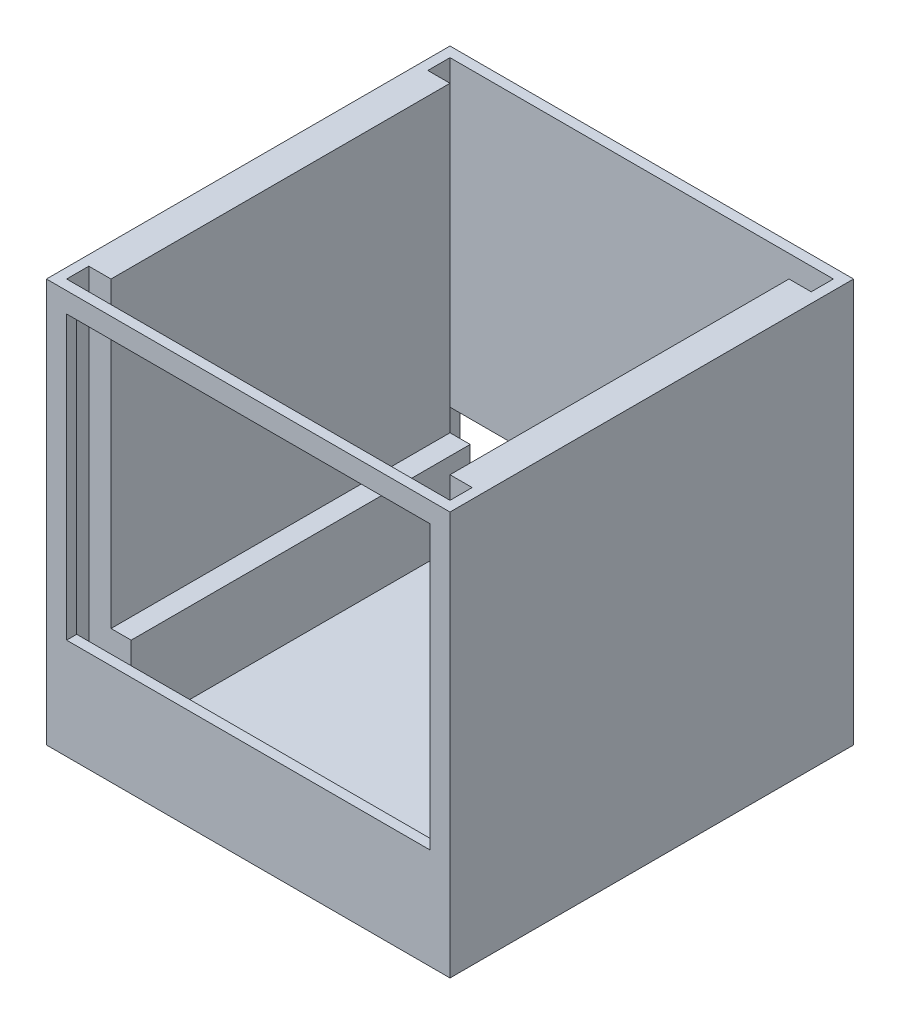
ISO-10303-21;
HEADER;
FILE_DESCRIPTION(('STEP AP214'),'2;1');
FILE_NAME('part.step','',(''),(''),'','','');
FILE_SCHEMA(('AUTOMOTIVE_DESIGN { 1 0 10303 214 1 1 1 1 }'));
ENDSEC;
DATA;
#1=APPLICATION_CONTEXT('core data for automotive mechanical design processes');
#2=APPLICATION_PROTOCOL_DEFINITION('international standard','automotive_design',2000,#1);
#3=PRODUCT_CONTEXT('',#1,'mechanical');
#4=PRODUCT('Part','Part','',(#3));
#5=PRODUCT_RELATED_PRODUCT_CATEGORY('part','',(#4));
#6=PRODUCT_DEFINITION_FORMATION('','',#4);
#7=PRODUCT_DEFINITION_CONTEXT('part definition',#1,'design');
#8=PRODUCT_DEFINITION('design','',#6,#7);
#9=PRODUCT_DEFINITION_SHAPE('','',#8);
#10=(LENGTH_UNIT() NAMED_UNIT(*) SI_UNIT(.MILLI.,.METRE.));
#11=(NAMED_UNIT(*) PLANE_ANGLE_UNIT() SI_UNIT($,.RADIAN.));
#12=(NAMED_UNIT(*) SI_UNIT($,.STERADIAN.) SOLID_ANGLE_UNIT());
#13=UNCERTAINTY_MEASURE_WITH_UNIT(LENGTH_MEASURE(1.E-05),#10,'distance_accuracy_value','');
#14=(GEOMETRIC_REPRESENTATION_CONTEXT(3) GLOBAL_UNCERTAINTY_ASSIGNED_CONTEXT((#13)) GLOBAL_UNIT_ASSIGNED_CONTEXT((#10,
#11,#12)) REPRESENTATION_CONTEXT('',''));
#15=CARTESIAN_POINT('',(0.,0.,0.));
#16=DIRECTION('',(0.,0.,1.));
#17=DIRECTION('',(1.,0.,0.));
#18=AXIS2_PLACEMENT_3D('',#15,#16,#17);
#19=CARTESIAN_POINT('',(0.,-50.8,0.));
#20=DIRECTION('',(0.,-1.,0.));
#21=DIRECTION('',(0.,0.,-1.));
#22=AXIS2_PLACEMENT_3D('',#19,#20,#21);
#23=PLANE('',#22);
#24=DIRECTION('',(0.,0.,1.));
#25=VECTOR('',#24,1.);
#26=CARTESIAN_POINT('',(93.98,-50.8,-106.68));
#27=LINE('',#26,#25);
#28=CARTESIAN_POINT('',(93.98,-50.8,-106.68));
#29=VERTEX_POINT('',#28);
#30=CARTESIAN_POINT('',(93.98,-50.8,106.68));
#31=VERTEX_POINT('',#30);
#32=EDGE_CURVE('E226',#29,#31,#27,.T.);
#33=ORIENTED_EDGE('',*,*,#32,.F.);
#34=DIRECTION('',(-1.,0.,0.));
#35=VECTOR('',#34,1.);
#36=CARTESIAN_POINT('',(0.,-50.8,-106.68));
#37=LINE('',#36,#35);
#38=CARTESIAN_POINT('',(120.65,-50.8,-106.68));
#39=VERTEX_POINT('',#38);
#40=EDGE_CURVE('E232',#39,#29,#37,.T.);
#41=ORIENTED_EDGE('',*,*,#40,.F.);
#42=DIRECTION('',(0.,0.,-1.));
#43=VECTOR('',#42,1.);
#44=CARTESIAN_POINT('',(120.65,-50.8,0.));
#45=LINE('',#44,#43);
#46=CARTESIAN_POINT('',(120.65,-50.8,-127.));
#47=VERTEX_POINT('',#46);
#48=EDGE_CURVE('E355',#39,#47,#45,.T.);
#49=ORIENTED_EDGE('',*,*,#48,.T.);
#50=DIRECTION('',(1.,0.,0.));
#51=VECTOR('',#50,1.);
#52=CARTESIAN_POINT('',(-127.,-50.8,-127.));
#53=LINE('',#52,#51);
#54=CARTESIAN_POINT('',(-120.65,-50.8,-127.));
#55=VERTEX_POINT('',#54);
#56=EDGE_CURVE('E338',#55,#47,#53,.T.);
#57=ORIENTED_EDGE('',*,*,#56,.F.);
#58=DIRECTION('',(0.,0.,-1.));
#59=VECTOR('',#58,1.);
#60=CARTESIAN_POINT('',(-120.65,-50.8,0.));
#61=LINE('',#60,#59);
#62=CARTESIAN_POINT('',(-120.65,-50.8,-106.68));
#63=VERTEX_POINT('',#62);
#64=EDGE_CURVE('E361',#63,#55,#61,.T.);
#65=ORIENTED_EDGE('',*,*,#64,.F.);
#66=DIRECTION('',(1.,0.,0.));
#67=VECTOR('',#66,1.);
#68=CARTESIAN_POINT('',(0.,-50.8,-106.68));
#69=LINE('',#68,#67);
#70=CARTESIAN_POINT('',(-93.98,-50.8,-106.68));
#71=VERTEX_POINT('',#70);
#72=EDGE_CURVE('E290',#63,#71,#69,.T.);
#73=ORIENTED_EDGE('',*,*,#72,.T.);
#74=DIRECTION('',(0.,0.,1.));
#75=VECTOR('',#74,1.);
#76=CARTESIAN_POINT('',(-93.98,-50.8,0.));
#77=LINE('',#76,#75);
#78=CARTESIAN_POINT('',(-93.98,-50.8,106.68));
#79=VERTEX_POINT('',#78);
#80=EDGE_CURVE('E249',#71,#79,#77,.T.);
#81=ORIENTED_EDGE('',*,*,#80,.T.);
#82=DIRECTION('',(1.,0.,0.));
#83=VECTOR('',#82,1.);
#84=CARTESIAN_POINT('',(0.,-50.8,106.68));
#85=LINE('',#84,#83);
#86=CARTESIAN_POINT('',(-120.65,-50.8,106.68));
#87=VERTEX_POINT('',#86);
#88=EDGE_CURVE('E293',#87,#79,#85,.T.);
#89=ORIENTED_EDGE('',*,*,#88,.F.);
#90=CARTESIAN_POINT('',(-120.65,-50.8,120.65));
#91=VERTEX_POINT('',#90);
#92=EDGE_CURVE('E362',#91,#87,#61,.T.);
#93=ORIENTED_EDGE('',*,*,#92,.F.);
#94=DIRECTION('',(1.,0.,0.));
#95=VECTOR('',#94,1.);
#96=CARTESIAN_POINT('',(0.,-50.8,120.65));
#97=LINE('',#96,#95);
#98=CARTESIAN_POINT('',(120.65,-50.8,120.65));
#99=VERTEX_POINT('',#98);
#100=EDGE_CURVE('E366',#91,#99,#97,.T.);
#101=ORIENTED_EDGE('',*,*,#100,.T.);
#102=CARTESIAN_POINT('',(120.65,-50.8,106.68));
#103=VERTEX_POINT('',#102);
#104=EDGE_CURVE('E228',#99,#103,#45,.T.);
#105=ORIENTED_EDGE('',*,*,#104,.T.);
#106=DIRECTION('',(-1.,0.,0.));
#107=VECTOR('',#106,1.);
#108=CARTESIAN_POINT('',(0.,-50.8,106.68));
#109=LINE('',#108,#107);
#110=EDGE_CURVE('E222',#103,#31,#109,.T.);
#111=ORIENTED_EDGE('',*,*,#110,.T.);
#112=EDGE_LOOP('',(#33,#41,#49,#57,#65,#73,#81,#89,#93,#101,#105,#111));
#113=FACE_BOUND('',#112,.T.);
#114=ADVANCED_FACE('F45',(#113),#23,.F.);
#115=CARTESIAN_POINT('',(-120.65,190.5,0.));
#116=DIRECTION('',(-1.,0.,0.));
#117=DIRECTION('',(0.,0.,1.));
#118=AXIS2_PLACEMENT_3D('',#115,#116,#117);
#119=PLANE('',#118);
#120=DIRECTION('',(0.,-1.,0.));
#121=VECTOR('',#120,1.);
#122=CARTESIAN_POINT('',(-120.65,190.5,-106.68));
#123=LINE('',#122,#121);
#124=CARTESIAN_POINT('',(-120.65,190.5,-106.68));
#125=VERTEX_POINT('',#124);
#126=EDGE_CURVE('E63',#125,#63,#123,.T.);
#127=ORIENTED_EDGE('',*,*,#126,.T.);
#128=ORIENTED_EDGE('',*,*,#64,.T.);
#129=DIRECTION('',(0.,1.,0.));
#130=VECTOR('',#129,1.);
#131=CARTESIAN_POINT('',(-120.65,-50.8,-127.));
#132=LINE('',#131,#130);
#133=CARTESIAN_POINT('',(-120.65,0.,-127.));
#134=VERTEX_POINT('',#133);
#135=EDGE_CURVE('E368',#55,#134,#132,.T.);
#136=ORIENTED_EDGE('',*,*,#135,.T.);
#137=DIRECTION('',(0.,0.,-1.));
#138=VECTOR('',#137,1.);
#139=CARTESIAN_POINT('',(-120.65,0.,0.));
#140=LINE('',#139,#138);
#141=CARTESIAN_POINT('',(-120.65,0.,-120.65));
#142=VERTEX_POINT('',#141);
#143=EDGE_CURVE('E55',#142,#134,#140,.T.);
#144=ORIENTED_EDGE('',*,*,#143,.F.);
#145=DIRECTION('',(0.,-1.,0.));
#146=VECTOR('',#145,1.);
#147=CARTESIAN_POINT('',(-120.65,190.5,-120.65));
#148=LINE('',#147,#146);
#149=CARTESIAN_POINT('',(-120.65,190.5,-120.65));
#150=VERTEX_POINT('',#149);
#151=EDGE_CURVE('E433',#150,#142,#148,.T.);
#152=ORIENTED_EDGE('',*,*,#151,.F.);
#153=DIRECTION('',(0.,0.,-1.));
#154=VECTOR('',#153,1.);
#155=CARTESIAN_POINT('',(-120.65,190.5,0.));
#156=LINE('',#155,#154);
#157=EDGE_CURVE('E408',#125,#150,#156,.T.);
#158=ORIENTED_EDGE('',*,*,#157,.F.);
#159=EDGE_LOOP('',(#127,#128,#136,#144,#152,#158));
#160=FACE_BOUND('',#159,.T.);
#161=ADVANCED_FACE('F515',(#160),#119,.F.);
#162=CARTESIAN_POINT('',(120.65,190.5,0.));
#163=DIRECTION('',(-1.,0.,0.));
#164=DIRECTION('',(0.,0.,1.));
#165=AXIS2_PLACEMENT_3D('',#162,#163,#164);
#166=PLANE('',#165);
#167=DIRECTION('',(0.,-1.,0.));
#168=VECTOR('',#167,1.);
#169=CARTESIAN_POINT('',(120.65,190.5,106.68));
#170=LINE('',#169,#168);
#171=CARTESIAN_POINT('',(120.65,190.5,106.68));
#172=VERTEX_POINT('',#171);
#173=EDGE_CURVE('E473',#172,#103,#170,.T.);
#174=ORIENTED_EDGE('',*,*,#173,.T.);
#175=ORIENTED_EDGE('',*,*,#104,.F.);
#176=DIRECTION('',(0.,-1.,0.));
#177=VECTOR('',#176,1.);
#178=CARTESIAN_POINT('',(120.65,190.5,120.65));
#179=LINE('',#178,#177);
#180=CARTESIAN_POINT('',(120.65,190.5,120.65));
#181=VERTEX_POINT('',#180);
#182=EDGE_CURVE('E469',#181,#99,#179,.T.);
#183=ORIENTED_EDGE('',*,*,#182,.F.);
#184=DIRECTION('',(0.,0.,-1.));
#185=VECTOR('',#184,1.);
#186=CARTESIAN_POINT('',(120.65,190.5,0.));
#187=LINE('',#186,#185);
#188=EDGE_CURVE('E390',#181,#172,#187,.T.);
#189=ORIENTED_EDGE('',*,*,#188,.T.);
#190=EDGE_LOOP('',(#174,#175,#183,#189));
#191=FACE_BOUND('',#190,.T.);
#192=ADVANCED_FACE('F534',(#191),#166,.T.);
#193=CARTESIAN_POINT('',(0.,0.,0.));
#194=DIRECTION('',(0.,1.,0.));
#195=DIRECTION('',(0.,0.,1.));
#196=AXIS2_PLACEMENT_3D('',#193,#194,#195);
#197=PLANE('',#196);
#198=DIRECTION('',(0.,0.,-1.));
#199=VECTOR('',#198,1.);
#200=CARTESIAN_POINT('',(120.65,0.,0.));
#201=LINE('',#200,#199);
#202=CARTESIAN_POINT('',(120.65,0.,-120.65));
#203=VERTEX_POINT('',#202);
#204=CARTESIAN_POINT('',(120.65,0.,-127.));
#205=VERTEX_POINT('',#204);
#206=EDGE_CURVE('E11',#203,#205,#201,.T.);
#207=ORIENTED_EDGE('',*,*,#206,.F.);
#208=DIRECTION('',(1.,0.,0.));
#209=VECTOR('',#208,1.);
#210=CARTESIAN_POINT('',(0.,0.,-120.65));
#211=LINE('',#210,#209);
#212=EDGE_CURVE('E380',#142,#203,#211,.T.);
#213=ORIENTED_EDGE('',*,*,#212,.F.);
#214=ORIENTED_EDGE('',*,*,#143,.T.);
#215=DIRECTION('',(1.,0.,0.));
#216=VECTOR('',#215,1.);
#217=CARTESIAN_POINT('',(0.,0.,-127.));
#218=LINE('',#217,#216);
#219=EDGE_CURVE('E385',#134,#205,#218,.T.);
#220=ORIENTED_EDGE('',*,*,#219,.T.);
#221=EDGE_LOOP('',(#207,#213,#214,#220));
#222=FACE_BOUND('',#221,.T.);
#223=ADVANCED_FACE('F499',(#222),#197,.F.);
#224=CARTESIAN_POINT('',(127.,190.5,0.));
#225=DIRECTION('',(-1.,0.,0.));
#226=DIRECTION('',(0.,0.,1.));
#227=AXIS2_PLACEMENT_3D('',#224,#225,#226);
#228=PLANE('',#227);
#229=DIRECTION('',(0.,-1.,0.));
#230=VECTOR('',#229,1.);
#231=CARTESIAN_POINT('',(127.,190.5,127.));
#232=LINE('',#231,#230);
#233=CARTESIAN_POINT('',(127.,190.5,127.));
#234=VERTEX_POINT('',#233);
#235=CARTESIAN_POINT('',(127.,-63.5,127.));
#236=VERTEX_POINT('',#235);
#237=EDGE_CURVE('E440',#234,#236,#232,.T.);
#238=ORIENTED_EDGE('',*,*,#237,.T.);
#239=DIRECTION('',(0.,0.,1.));
#240=VECTOR('',#239,1.);
#241=CARTESIAN_POINT('',(127.,-63.5,127.));
#242=LINE('',#241,#240);
#243=CARTESIAN_POINT('',(127.,-63.5,-127.));
#244=VERTEX_POINT('',#243);
#245=EDGE_CURVE('E347',#244,#236,#242,.T.);
#246=ORIENTED_EDGE('',*,*,#245,.F.);
#247=DIRECTION('',(0.,-1.,0.));
#248=VECTOR('',#247,1.);
#249=CARTESIAN_POINT('',(127.,190.5,-127.));
#250=LINE('',#249,#248);
#251=CARTESIAN_POINT('',(127.,190.5,-127.));
#252=VERTEX_POINT('',#251);
#253=EDGE_CURVE('E373',#252,#244,#250,.T.);
#254=ORIENTED_EDGE('',*,*,#253,.F.);
#255=DIRECTION('',(0.,0.,-1.));
#256=VECTOR('',#255,1.);
#257=CARTESIAN_POINT('',(127.,190.5,0.));
#258=LINE('',#257,#256);
#259=EDGE_CURVE('E419',#234,#252,#258,.T.);
#260=ORIENTED_EDGE('',*,*,#259,.F.);
#261=EDGE_LOOP('',(#238,#246,#254,#260));
#262=FACE_BOUND('',#261,.T.);
#263=ADVANCED_FACE('F568',(#262),#228,.F.);
#264=CARTESIAN_POINT('',(0.,190.5,-127.));
#265=DIRECTION('',(0.,0.,-1.));
#266=DIRECTION('',(-1.,0.,0.));
#267=AXIS2_PLACEMENT_3D('',#264,#265,#266);
#268=PLANE('',#267);
#269=ORIENTED_EDGE('',*,*,#253,.T.);
#270=DIRECTION('',(1.,0.,0.));
#271=VECTOR('',#270,1.);
#272=CARTESIAN_POINT('',(-127.,-63.5,-127.));
#273=LINE('',#272,#271);
#274=CARTESIAN_POINT('',(-127.,-63.5,-127.));
#275=VERTEX_POINT('',#274);
#276=EDGE_CURVE('E343',#275,#244,#273,.T.);
#277=ORIENTED_EDGE('',*,*,#276,.F.);
#278=DIRECTION('',(0.,-1.,0.));
#279=VECTOR('',#278,1.);
#280=CARTESIAN_POINT('',(-127.,190.5,-127.));
#281=LINE('',#280,#279);
#282=CARTESIAN_POINT('',(-127.,190.5,-127.));
#283=VERTEX_POINT('',#282);
#284=EDGE_CURVE('E446',#283,#275,#281,.T.);
#285=ORIENTED_EDGE('',*,*,#284,.F.);
#286=DIRECTION('',(1.,0.,0.));
#287=VECTOR('',#286,1.);
#288=CARTESIAN_POINT('',(0.,190.5,-127.));
#289=LINE('',#288,#287);
#290=EDGE_CURVE('E422',#283,#252,#289,.T.);
#291=ORIENTED_EDGE('',*,*,#290,.T.);
#292=EDGE_LOOP('',(#269,#277,#285,#291));
#293=FACE_BOUND('',#292,.T.);
#294=ORIENTED_EDGE('',*,*,#219,.F.);
#295=ORIENTED_EDGE('',*,*,#135,.F.);
#296=ORIENTED_EDGE('',*,*,#56,.T.);
#297=DIRECTION('',(0.,1.,0.));
#298=VECTOR('',#297,1.);
#299=CARTESIAN_POINT('',(120.65,-50.8,-127.));
#300=LINE('',#299,#298);
#301=EDGE_CURVE('E376',#47,#205,#300,.T.);
#302=ORIENTED_EDGE('',*,*,#301,.T.);
#303=EDGE_LOOP('',(#294,#295,#296,#302));
#304=FACE_BOUND('',#303,.T.);
#305=ADVANCED_FACE('F503',(#293,#304),#268,.T.);
#306=CARTESIAN_POINT('',(-127.,190.5,0.));
#307=DIRECTION('',(-1.,0.,0.));
#308=DIRECTION('',(0.,0.,1.));
#309=AXIS2_PLACEMENT_3D('',#306,#307,#308);
#310=PLANE('',#309);
#311=ORIENTED_EDGE('',*,*,#284,.T.);
#312=DIRECTION('',(0.,0.,-1.));
#313=VECTOR('',#312,1.);
#314=CARTESIAN_POINT('',(-127.,-63.5,127.));
#315=LINE('',#314,#313);
#316=CARTESIAN_POINT('',(-127.,-63.5,127.));
#317=VERTEX_POINT('',#316);
#318=EDGE_CURVE('E339',#317,#275,#315,.T.);
#319=ORIENTED_EDGE('',*,*,#318,.F.);
#320=DIRECTION('',(0.,-1.,0.));
#321=VECTOR('',#320,1.);
#322=CARTESIAN_POINT('',(-127.,190.5,127.));
#323=LINE('',#322,#321);
#324=CARTESIAN_POINT('',(-127.,190.5,127.));
#325=VERTEX_POINT('',#324);
#326=EDGE_CURVE('E443',#325,#317,#323,.T.);
#327=ORIENTED_EDGE('',*,*,#326,.F.);
#328=DIRECTION('',(0.,0.,-1.));
#329=VECTOR('',#328,1.);
#330=CARTESIAN_POINT('',(-127.,190.5,0.));
#331=LINE('',#330,#329);
#332=EDGE_CURVE('E426',#325,#283,#331,.T.);
#333=ORIENTED_EDGE('',*,*,#332,.T.);
#334=EDGE_LOOP('',(#311,#319,#327,#333));
#335=FACE_BOUND('',#334,.T.);
#336=ADVANCED_FACE('F552',(#335),#310,.T.);
#337=CARTESIAN_POINT('',(0.,190.5,-120.65));
#338=DIRECTION('',(0.,0.,-1.));
#339=DIRECTION('',(-1.,0.,0.));
#340=AXIS2_PLACEMENT_3D('',#337,#338,#339);
#341=PLANE('',#340);
#342=ORIENTED_EDGE('',*,*,#212,.T.);
#343=DIRECTION('',(0.,-1.,0.));
#344=VECTOR('',#343,1.);
#345=CARTESIAN_POINT('',(120.65,190.5,-120.65));
#346=LINE('',#345,#344);
#347=CARTESIAN_POINT('',(120.65,190.5,-120.65));
#348=VERTEX_POINT('',#347);
#349=EDGE_CURVE('E49',#348,#203,#346,.T.);
#350=ORIENTED_EDGE('',*,*,#349,.F.);
#351=DIRECTION('',(1.,0.,0.));
#352=VECTOR('',#351,1.);
#353=CARTESIAN_POINT('',(0.,190.5,-120.65));
#354=LINE('',#353,#352);
#355=EDGE_CURVE('E381',#150,#348,#354,.T.);
#356=ORIENTED_EDGE('',*,*,#355,.F.);
#357=ORIENTED_EDGE('',*,*,#151,.T.);
#358=EDGE_LOOP('',(#342,#350,#356,#357));
#359=FACE_BOUND('',#358,.T.);
#360=ADVANCED_FACE('F47',(#359),#341,.F.);
#361=CARTESIAN_POINT('',(0.,190.5,-106.68));
#362=DIRECTION('',(0.,0.,1.));
#363=DIRECTION('',(1.,0.,0.));
#364=AXIS2_PLACEMENT_3D('',#361,#362,#363);
#365=PLANE('',#364);
#366=DIRECTION('',(0.,-1.,0.));
#367=VECTOR('',#366,1.);
#368=CARTESIAN_POINT('',(120.65,190.5,-106.68));
#369=LINE('',#368,#367);
#370=CARTESIAN_POINT('',(120.65,190.5,-106.68));
#371=VERTEX_POINT('',#370);
#372=EDGE_CURVE('E482',#371,#39,#369,.T.);
#373=ORIENTED_EDGE('',*,*,#372,.T.);
#374=ORIENTED_EDGE('',*,*,#40,.T.);
#375=DIRECTION('',(0.,-1.,0.));
#376=VECTOR('',#375,1.);
#377=CARTESIAN_POINT('',(93.98,0.,-106.68));
#378=LINE('',#377,#376);
#379=CARTESIAN_POINT('',(93.98,0.,-106.68));
#380=VERTEX_POINT('',#379);
#381=EDGE_CURVE('E243',#380,#29,#378,.T.);
#382=ORIENTED_EDGE('',*,*,#381,.F.);
#383=DIRECTION('',(-1.,0.,0.));
#384=VECTOR('',#383,1.);
#385=CARTESIAN_POINT('',(106.68,0.,-106.68));
#386=LINE('',#385,#384);
#387=CARTESIAN_POINT('',(106.68,0.,-106.68));
#388=VERTEX_POINT('',#387);
#389=EDGE_CURVE('E250',#388,#380,#386,.T.);
#390=ORIENTED_EDGE('',*,*,#389,.F.);
#391=DIRECTION('',(0.,-1.,0.));
#392=VECTOR('',#391,1.);
#393=CARTESIAN_POINT('',(106.68,190.5,-106.68));
#394=LINE('',#393,#392);
#395=CARTESIAN_POINT('',(106.68,190.5,-106.68));
#396=VERTEX_POINT('',#395);
#397=EDGE_CURVE('E479',#396,#388,#394,.T.);
#398=ORIENTED_EDGE('',*,*,#397,.F.);
#399=DIRECTION('',(-1.,0.,0.));
#400=VECTOR('',#399,1.);
#401=CARTESIAN_POINT('',(0.,190.5,-106.68));
#402=LINE('',#401,#400);
#403=EDGE_CURVE('E389',#371,#396,#402,.T.);
#404=ORIENTED_EDGE('',*,*,#403,.F.);
#405=EDGE_LOOP('',(#373,#374,#382,#390,#398,#404));
#406=FACE_BOUND('',#405,.T.);
#407=ADVANCED_FACE('F544',(#406),#365,.F.);
#408=CARTESIAN_POINT('',(106.68,190.5,0.));
#409=DIRECTION('',(1.,0.,0.));
#410=DIRECTION('',(0.,0.,-1.));
#411=AXIS2_PLACEMENT_3D('',#408,#409,#410);
#412=PLANE('',#411);
#413=ORIENTED_EDGE('',*,*,#397,.T.);
#414=DIRECTION('',(0.,0.,1.));
#415=VECTOR('',#414,1.);
#416=CARTESIAN_POINT('',(106.68,0.,-106.68));
#417=LINE('',#416,#415);
#418=CARTESIAN_POINT('',(106.68,0.,106.68));
#419=VERTEX_POINT('',#418);
#420=EDGE_CURVE('E242',#388,#419,#417,.T.);
#421=ORIENTED_EDGE('',*,*,#420,.T.);
#422=DIRECTION('',(0.,-1.,0.));
#423=VECTOR('',#422,1.);
#424=CARTESIAN_POINT('',(106.68,190.5,106.68));
#425=LINE('',#424,#423);
#426=CARTESIAN_POINT('',(106.68,190.5,106.68));
#427=VERTEX_POINT('',#426);
#428=EDGE_CURVE('E476',#427,#419,#425,.T.);
#429=ORIENTED_EDGE('',*,*,#428,.F.);
#430=DIRECTION('',(0.,0.,1.));
#431=VECTOR('',#430,1.);
#432=CARTESIAN_POINT('',(106.68,190.5,0.));
#433=LINE('',#432,#431);
#434=EDGE_CURVE('E393',#396,#427,#433,.T.);
#435=ORIENTED_EDGE('',*,*,#434,.F.);
#436=EDGE_LOOP('',(#413,#421,#429,#435));
#437=FACE_BOUND('',#436,.T.);
#438=ADVANCED_FACE('F539',(#437),#412,.F.);
#439=CARTESIAN_POINT('',(0.,190.5,106.68));
#440=DIRECTION('',(0.,0.,1.));
#441=DIRECTION('',(1.,0.,0.));
#442=AXIS2_PLACEMENT_3D('',#439,#440,#441);
#443=PLANE('',#442);
#444=ORIENTED_EDGE('',*,*,#428,.T.);
#445=DIRECTION('',(-1.,0.,0.));
#446=VECTOR('',#445,1.);
#447=CARTESIAN_POINT('',(106.68,0.,106.68));
#448=LINE('',#447,#446);
#449=CARTESIAN_POINT('',(93.98,0.,106.68));
#450=VERTEX_POINT('',#449);
#451=EDGE_CURVE('E239',#419,#450,#448,.T.);
#452=ORIENTED_EDGE('',*,*,#451,.T.);
#453=DIRECTION('',(0.,-1.,0.));
#454=VECTOR('',#453,1.);
#455=CARTESIAN_POINT('',(93.98,0.,106.68));
#456=LINE('',#455,#454);
#457=EDGE_CURVE('E236',#450,#31,#456,.T.);
#458=ORIENTED_EDGE('',*,*,#457,.T.);
#459=ORIENTED_EDGE('',*,*,#110,.F.);
#460=ORIENTED_EDGE('',*,*,#173,.F.);
#461=DIRECTION('',(-1.,0.,0.));
#462=VECTOR('',#461,1.);
#463=CARTESIAN_POINT('',(0.,190.5,106.68));
#464=LINE('',#463,#462);
#465=EDGE_CURVE('E396',#172,#427,#464,.T.);
#466=ORIENTED_EDGE('',*,*,#465,.T.);
#467=EDGE_LOOP('',(#444,#452,#458,#459,#460,#466));
#468=FACE_BOUND('',#467,.T.);
#469=ADVANCED_FACE('F238',(#468),#443,.T.);
#470=ORIENTED_EDGE('',*,*,#48,.F.);
#471=ORIENTED_EDGE('',*,*,#372,.F.);
#472=EDGE_CURVE('E384',#371,#348,#187,.T.);
#473=ORIENTED_EDGE('',*,*,#472,.T.);
#474=ORIENTED_EDGE('',*,*,#349,.T.);
#475=ORIENTED_EDGE('',*,*,#206,.T.);
#476=ORIENTED_EDGE('',*,*,#301,.F.);
#477=EDGE_LOOP('',(#470,#471,#473,#474,#475,#476));
#478=FACE_BOUND('',#477,.T.);
#479=ADVANCED_FACE('F491',(#478),#166,.T.);
#480=CARTESIAN_POINT('',(0.,190.5,120.65));
#481=DIRECTION('',(0.,0.,-1.));
#482=DIRECTION('',(-1.,0.,0.));
#483=AXIS2_PLACEMENT_3D('',#480,#481,#482);
#484=PLANE('',#483);
#485=DIRECTION('',(0.,1.,0.));
#486=VECTOR('',#485,1.);
#487=CARTESIAN_POINT('',(-114.3,190.5,120.65));
#488=LINE('',#487,#486);
#489=CARTESIAN_POINT('',(-114.3,0.,120.65));
#490=VERTEX_POINT('',#489);
#491=CARTESIAN_POINT('',(-114.3,177.8,120.65));
#492=VERTEX_POINT('',#491);
#493=EDGE_CURVE('E335',#490,#492,#488,.T.);
#494=ORIENTED_EDGE('',*,*,#493,.F.);
#495=DIRECTION('',(-1.,0.,0.));
#496=VECTOR('',#495,1.);
#497=CARTESIAN_POINT('',(0.,0.,120.65));
#498=LINE('',#497,#496);
#499=CARTESIAN_POINT('',(114.3,0.,120.65));
#500=VERTEX_POINT('',#499);
#501=EDGE_CURVE('E316',#500,#490,#498,.T.);
#502=ORIENTED_EDGE('',*,*,#501,.F.);
#503=DIRECTION('',(0.,-1.,0.));
#504=VECTOR('',#503,1.);
#505=CARTESIAN_POINT('',(114.3,190.5,120.65));
#506=LINE('',#505,#504);
#507=CARTESIAN_POINT('',(114.3,177.8,120.65));
#508=VERTEX_POINT('',#507);
#509=EDGE_CURVE('E328',#508,#500,#506,.T.);
#510=ORIENTED_EDGE('',*,*,#509,.F.);
#511=DIRECTION('',(1.,0.,0.));
#512=VECTOR('',#511,1.);
#513=CARTESIAN_POINT('',(0.,177.8,120.65));
#514=LINE('',#513,#512);
#515=EDGE_CURVE('E332',#492,#508,#514,.T.);
#516=ORIENTED_EDGE('',*,*,#515,.F.);
#517=EDGE_LOOP('',(#494,#502,#510,#516));
#518=FACE_BOUND('',#517,.T.);
#519=ORIENTED_EDGE('',*,*,#182,.T.);
#520=ORIENTED_EDGE('',*,*,#100,.F.);
#521=DIRECTION('',(0.,-1.,0.));
#522=VECTOR('',#521,1.);
#523=CARTESIAN_POINT('',(-120.65,190.5,120.65));
#524=LINE('',#523,#522);
#525=CARTESIAN_POINT('',(-120.65,190.5,120.65));
#526=VERTEX_POINT('',#525);
#527=EDGE_CURVE('E466',#526,#91,#524,.T.);
#528=ORIENTED_EDGE('',*,*,#527,.F.);
#529=DIRECTION('',(1.,0.,0.));
#530=VECTOR('',#529,1.);
#531=CARTESIAN_POINT('',(0.,190.5,120.65));
#532=LINE('',#531,#530);
#533=EDGE_CURVE('E400',#526,#181,#532,.T.);
#534=ORIENTED_EDGE('',*,*,#533,.T.);
#535=EDGE_LOOP('',(#519,#520,#528,#534));
#536=FACE_BOUND('',#535,.T.);
#537=ADVANCED_FACE('F531',(#518,#536),#484,.T.);
#538=CARTESIAN_POINT('',(0.,190.5,106.68));
#539=DIRECTION('',(0.,0.,-1.));
#540=DIRECTION('',(-1.,0.,0.));
#541=AXIS2_PLACEMENT_3D('',#538,#539,#540);
#542=PLANE('',#541);
#543=DIRECTION('',(0.,-1.,0.));
#544=VECTOR('',#543,1.);
#545=CARTESIAN_POINT('',(-120.65,190.5,106.68));
#546=LINE('',#545,#544);
#547=CARTESIAN_POINT('',(-120.65,190.5,106.68));
#548=VERTEX_POINT('',#547);
#549=EDGE_CURVE('E71',#548,#87,#546,.T.);
#550=ORIENTED_EDGE('',*,*,#549,.T.);
#551=ORIENTED_EDGE('',*,*,#88,.T.);
#552=DIRECTION('',(0.,-1.,0.));
#553=VECTOR('',#552,1.);
#554=CARTESIAN_POINT('',(-93.98,0.,106.68));
#555=LINE('',#554,#553);
#556=CARTESIAN_POINT('',(-93.98,0.,106.68));
#557=VERTEX_POINT('',#556);
#558=EDGE_CURVE('E281',#557,#79,#555,.T.);
#559=ORIENTED_EDGE('',*,*,#558,.F.);
#560=DIRECTION('',(1.,0.,0.));
#561=VECTOR('',#560,1.);
#562=CARTESIAN_POINT('',(0.,0.,106.68));
#563=LINE('',#562,#561);
#564=CARTESIAN_POINT('',(-106.68,0.,106.68));
#565=VERTEX_POINT('',#564);
#566=EDGE_CURVE('E279',#565,#557,#563,.T.);
#567=ORIENTED_EDGE('',*,*,#566,.F.);
#568=DIRECTION('',(0.,-1.,0.));
#569=VECTOR('',#568,1.);
#570=CARTESIAN_POINT('',(-106.68,190.5,106.68));
#571=LINE('',#570,#569);
#572=CARTESIAN_POINT('',(-106.68,190.5,106.68));
#573=VERTEX_POINT('',#572);
#574=EDGE_CURVE('E460',#573,#565,#571,.T.);
#575=ORIENTED_EDGE('',*,*,#574,.F.);
#576=DIRECTION('',(1.,0.,0.));
#577=VECTOR('',#576,1.);
#578=CARTESIAN_POINT('',(0.,190.5,106.68));
#579=LINE('',#578,#577);
#580=EDGE_CURVE('E407',#548,#573,#579,.T.);
#581=ORIENTED_EDGE('',*,*,#580,.F.);
#582=EDGE_LOOP('',(#550,#551,#559,#567,#575,#581));
#583=FACE_BOUND('',#582,.T.);
#584=ADVANCED_FACE('F587',(#583),#542,.F.);
#585=CARTESIAN_POINT('',(-106.68,190.5,0.));
#586=DIRECTION('',(1.,0.,0.));
#587=DIRECTION('',(0.,0.,-1.));
#588=AXIS2_PLACEMENT_3D('',#585,#586,#587);
#589=PLANE('',#588);
#590=DIRECTION('',(0.,0.,1.));
#591=VECTOR('',#590,1.);
#592=CARTESIAN_POINT('',(-106.68,0.,0.));
#593=LINE('',#592,#591);
#594=CARTESIAN_POINT('',(-106.68,0.,-106.68));
#595=VERTEX_POINT('',#594);
#596=EDGE_CURVE('E276',#595,#565,#593,.T.);
#597=ORIENTED_EDGE('',*,*,#596,.F.);
#598=DIRECTION('',(0.,-1.,0.));
#599=VECTOR('',#598,1.);
#600=CARTESIAN_POINT('',(-106.68,190.5,-106.68));
#601=LINE('',#600,#599);
#602=CARTESIAN_POINT('',(-106.68,190.5,-106.68));
#603=VERTEX_POINT('',#602);
#604=EDGE_CURVE('E456',#603,#595,#601,.T.);
#605=ORIENTED_EDGE('',*,*,#604,.F.);
#606=DIRECTION('',(0.,0.,1.));
#607=VECTOR('',#606,1.);
#608=CARTESIAN_POINT('',(-106.68,190.5,0.));
#609=LINE('',#608,#607);
#610=EDGE_CURVE('E411',#603,#573,#609,.T.);
#611=ORIENTED_EDGE('',*,*,#610,.T.);
#612=ORIENTED_EDGE('',*,*,#574,.T.);
#613=EDGE_LOOP('',(#597,#605,#611,#612));
#614=FACE_BOUND('',#613,.T.);
#615=ADVANCED_FACE('F584',(#614),#589,.T.);
#616=CARTESIAN_POINT('',(0.,190.5,-106.68));
#617=DIRECTION('',(0.,0.,-1.));
#618=DIRECTION('',(-1.,0.,0.));
#619=AXIS2_PLACEMENT_3D('',#616,#617,#618);
#620=PLANE('',#619);
#621=ORIENTED_EDGE('',*,*,#604,.T.);
#622=DIRECTION('',(1.,0.,0.));
#623=VECTOR('',#622,1.);
#624=CARTESIAN_POINT('',(0.,0.,-106.68));
#625=LINE('',#624,#623);
#626=CARTESIAN_POINT('',(-93.98,0.,-106.68));
#627=VERTEX_POINT('',#626);
#628=EDGE_CURVE('E272',#595,#627,#625,.T.);
#629=ORIENTED_EDGE('',*,*,#628,.T.);
#630=DIRECTION('',(0.,-1.,0.));
#631=VECTOR('',#630,1.);
#632=CARTESIAN_POINT('',(-93.98,0.,-106.68));
#633=LINE('',#632,#631);
#634=EDGE_CURVE('E286',#627,#71,#633,.T.);
#635=ORIENTED_EDGE('',*,*,#634,.T.);
#636=ORIENTED_EDGE('',*,*,#72,.F.);
#637=ORIENTED_EDGE('',*,*,#126,.F.);
#638=DIRECTION('',(1.,0.,0.));
#639=VECTOR('',#638,1.);
#640=CARTESIAN_POINT('',(0.,190.5,-106.68));
#641=LINE('',#640,#639);
#642=EDGE_CURVE('E415',#125,#603,#641,.T.);
#643=ORIENTED_EDGE('',*,*,#642,.T.);
#644=EDGE_LOOP('',(#621,#629,#635,#636,#637,#643));
#645=FACE_BOUND('',#644,.T.);
#646=ADVANCED_FACE('F518',(#645),#620,.T.);
#647=ORIENTED_EDGE('',*,*,#92,.T.);
#648=ORIENTED_EDGE('',*,*,#549,.F.);
#649=EDGE_CURVE('E404',#526,#548,#156,.T.);
#650=ORIENTED_EDGE('',*,*,#649,.F.);
#651=ORIENTED_EDGE('',*,*,#527,.T.);
#652=EDGE_LOOP('',(#647,#648,#650,#651));
#653=FACE_BOUND('',#652,.T.);
#654=ADVANCED_FACE('F526',(#653),#119,.F.);
#655=CARTESIAN_POINT('',(0.,190.5,127.));
#656=DIRECTION('',(0.,0.,-1.));
#657=DIRECTION('',(-1.,0.,0.));
#658=AXIS2_PLACEMENT_3D('',#655,#656,#657);
#659=PLANE('',#658);
#660=DIRECTION('',(1.,0.,0.));
#661=VECTOR('',#660,1.);
#662=CARTESIAN_POINT('',(-114.3,0.,127.));
#663=LINE('',#662,#661);
#664=CARTESIAN_POINT('',(-114.3,0.,127.));
#665=VERTEX_POINT('',#664);
#666=CARTESIAN_POINT('',(114.3,0.,127.));
#667=VERTEX_POINT('',#666);
#668=EDGE_CURVE('E300',#665,#667,#663,.T.);
#669=ORIENTED_EDGE('',*,*,#668,.F.);
#670=DIRECTION('',(0.,-1.,0.));
#671=VECTOR('',#670,1.);
#672=CARTESIAN_POINT('',(-114.3,177.8,127.));
#673=LINE('',#672,#671);
#674=CARTESIAN_POINT('',(-114.3,177.8,127.));
#675=VERTEX_POINT('',#674);
#676=EDGE_CURVE('E231',#675,#665,#673,.T.);
#677=ORIENTED_EDGE('',*,*,#676,.F.);
#678=DIRECTION('',(-1.,0.,0.));
#679=VECTOR('',#678,1.);
#680=CARTESIAN_POINT('',(-114.3,177.8,127.));
#681=LINE('',#680,#679);
#682=CARTESIAN_POINT('',(114.3,177.8,127.));
#683=VERTEX_POINT('',#682);
#684=EDGE_CURVE('E308',#683,#675,#681,.T.);
#685=ORIENTED_EDGE('',*,*,#684,.F.);
#686=DIRECTION('',(0.,1.,0.));
#687=VECTOR('',#686,1.);
#688=CARTESIAN_POINT('',(114.3,177.8,127.));
#689=LINE('',#688,#687);
#690=EDGE_CURVE('E304',#667,#683,#689,.T.);
#691=ORIENTED_EDGE('',*,*,#690,.F.);
#692=EDGE_LOOP('',(#669,#677,#685,#691));
#693=FACE_BOUND('',#692,.T.);
#694=ORIENTED_EDGE('',*,*,#326,.T.);
#695=DIRECTION('',(-1.,0.,0.));
#696=VECTOR('',#695,1.);
#697=CARTESIAN_POINT('',(-127.,-63.5,127.));
#698=LINE('',#697,#696);
#699=EDGE_CURVE('E351',#236,#317,#698,.T.);
#700=ORIENTED_EDGE('',*,*,#699,.F.);
#701=ORIENTED_EDGE('',*,*,#237,.F.);
#702=DIRECTION('',(1.,0.,0.));
#703=VECTOR('',#702,1.);
#704=CARTESIAN_POINT('',(0.,190.5,127.));
#705=LINE('',#704,#703);
#706=EDGE_CURVE('E430',#325,#234,#705,.T.);
#707=ORIENTED_EDGE('',*,*,#706,.F.);
#708=EDGE_LOOP('',(#694,#700,#701,#707));
#709=FACE_BOUND('',#708,.T.);
#710=ADVANCED_FACE('F565',(#693,#709),#659,.F.);
#711=CARTESIAN_POINT('',(0.,190.5,0.));
#712=DIRECTION('',(0.,1.,0.));
#713=DIRECTION('',(0.,0.,1.));
#714=AXIS2_PLACEMENT_3D('',#711,#712,#713);
#715=PLANE('',#714);
#716=ORIENTED_EDGE('',*,*,#355,.T.);
#717=ORIENTED_EDGE('',*,*,#472,.F.);
#718=ORIENTED_EDGE('',*,*,#403,.T.);
#719=ORIENTED_EDGE('',*,*,#434,.T.);
#720=ORIENTED_EDGE('',*,*,#465,.F.);
#721=ORIENTED_EDGE('',*,*,#188,.F.);
#722=ORIENTED_EDGE('',*,*,#533,.F.);
#723=ORIENTED_EDGE('',*,*,#649,.T.);
#724=ORIENTED_EDGE('',*,*,#580,.T.);
#725=ORIENTED_EDGE('',*,*,#610,.F.);
#726=ORIENTED_EDGE('',*,*,#642,.F.);
#727=ORIENTED_EDGE('',*,*,#157,.T.);
#728=EDGE_LOOP('',(#716,#717,#718,#719,#720,#721,#722,#723,#724,#725,#726,#727));
#729=FACE_BOUND('',#728,.T.);
#730=ORIENTED_EDGE('',*,*,#259,.T.);
#731=ORIENTED_EDGE('',*,*,#290,.F.);
#732=ORIENTED_EDGE('',*,*,#332,.F.);
#733=ORIENTED_EDGE('',*,*,#706,.T.);
#734=EDGE_LOOP('',(#730,#731,#732,#733));
#735=FACE_BOUND('',#734,.T.);
#736=ADVANCED_FACE('F512',(#729,#735),#715,.T.);
#737=CARTESIAN_POINT('',(0.,-63.5,0.));
#738=DIRECTION('',(0.,-1.,0.));
#739=DIRECTION('',(0.,0.,-1.));
#740=AXIS2_PLACEMENT_3D('',#737,#738,#739);
#741=PLANE('',#740);
#742=ORIENTED_EDGE('',*,*,#318,.T.);
#743=ORIENTED_EDGE('',*,*,#276,.T.);
#744=ORIENTED_EDGE('',*,*,#245,.T.);
#745=ORIENTED_EDGE('',*,*,#699,.T.);
#746=EDGE_LOOP('',(#742,#743,#744,#745));
#747=FACE_BOUND('',#746,.T.);
#748=ADVANCED_FACE('F561',(#747),#741,.T.);
#749=CARTESIAN_POINT('',(-114.3,177.8,114.3));
#750=DIRECTION('',(-1.,0.,0.));
#751=DIRECTION('',(0.,-1.,0.));
#752=AXIS2_PLACEMENT_3D('',#749,#750,#751);
#753=PLANE('',#752);
#754=ORIENTED_EDGE('',*,*,#493,.T.);
#755=DIRECTION('',(0.,0.,1.));
#756=VECTOR('',#755,1.);
#757=CARTESIAN_POINT('',(-114.3,177.8,114.3));
#758=LINE('',#757,#756);
#759=EDGE_CURVE('E313',#492,#675,#758,.T.);
#760=ORIENTED_EDGE('',*,*,#759,.T.);
#761=ORIENTED_EDGE('',*,*,#676,.T.);
#762=DIRECTION('',(0.,0.,1.));
#763=VECTOR('',#762,1.);
#764=CARTESIAN_POINT('',(-114.3,0.,114.3));
#765=LINE('',#764,#763);
#766=EDGE_CURVE('E312',#490,#665,#765,.T.);
#767=ORIENTED_EDGE('',*,*,#766,.F.);
#768=EDGE_LOOP('',(#754,#760,#761,#767));
#769=FACE_BOUND('',#768,.T.);
#770=ADVANCED_FACE('F643',(#769),#753,.F.);
#771=CARTESIAN_POINT('',(-114.3,177.8,114.3));
#772=DIRECTION('',(0.,1.,0.));
#773=DIRECTION('',(0.,0.,1.));
#774=AXIS2_PLACEMENT_3D('',#771,#772,#773);
#775=PLANE('',#774);
#776=ORIENTED_EDGE('',*,*,#515,.T.);
#777=DIRECTION('',(0.,0.,1.));
#778=VECTOR('',#777,1.);
#779=CARTESIAN_POINT('',(114.3,177.8,114.3));
#780=LINE('',#779,#778);
#781=EDGE_CURVE('E317',#508,#683,#780,.T.);
#782=ORIENTED_EDGE('',*,*,#781,.T.);
#783=ORIENTED_EDGE('',*,*,#684,.T.);
#784=ORIENTED_EDGE('',*,*,#759,.F.);
#785=EDGE_LOOP('',(#776,#782,#783,#784));
#786=FACE_BOUND('',#785,.T.);
#787=ADVANCED_FACE('F650',(#786),#775,.F.);
#788=CARTESIAN_POINT('',(114.3,177.8,114.3));
#789=DIRECTION('',(1.,0.,0.));
#790=DIRECTION('',(0.,1.,0.));
#791=AXIS2_PLACEMENT_3D('',#788,#789,#790);
#792=PLANE('',#791);
#793=ORIENTED_EDGE('',*,*,#509,.T.);
#794=DIRECTION('',(0.,0.,1.));
#795=VECTOR('',#794,1.);
#796=CARTESIAN_POINT('',(114.3,0.,114.3));
#797=LINE('',#796,#795);
#798=EDGE_CURVE('E320',#500,#667,#797,.T.);
#799=ORIENTED_EDGE('',*,*,#798,.T.);
#800=ORIENTED_EDGE('',*,*,#690,.T.);
#801=ORIENTED_EDGE('',*,*,#781,.F.);
#802=EDGE_LOOP('',(#793,#799,#800,#801));
#803=FACE_BOUND('',#802,.T.);
#804=ADVANCED_FACE('F657',(#803),#792,.F.);
#805=CARTESIAN_POINT('',(-114.3,0.,114.3));
#806=DIRECTION('',(0.,-1.,0.));
#807=DIRECTION('',(0.,0.,-1.));
#808=AXIS2_PLACEMENT_3D('',#805,#806,#807);
#809=PLANE('',#808);
#810=ORIENTED_EDGE('',*,*,#501,.T.);
#811=ORIENTED_EDGE('',*,*,#766,.T.);
#812=ORIENTED_EDGE('',*,*,#668,.T.);
#813=ORIENTED_EDGE('',*,*,#798,.F.);
#814=EDGE_LOOP('',(#810,#811,#812,#813));
#815=FACE_BOUND('',#814,.T.);
#816=ADVANCED_FACE('F665',(#815),#809,.F.);
#817=CARTESIAN_POINT('',(-93.98,0.,0.));
#818=DIRECTION('',(1.,0.,0.));
#819=DIRECTION('',(0.,0.,-1.));
#820=AXIS2_PLACEMENT_3D('',#817,#818,#819);
#821=PLANE('',#820);
#822=ORIENTED_EDGE('',*,*,#80,.F.);
#823=ORIENTED_EDGE('',*,*,#634,.F.);
#824=DIRECTION('',(0.,0.,1.));
#825=VECTOR('',#824,1.);
#826=CARTESIAN_POINT('',(-93.98,0.,0.));
#827=LINE('',#826,#825);
#828=EDGE_CURVE('E255',#627,#557,#827,.T.);
#829=ORIENTED_EDGE('',*,*,#828,.T.);
#830=ORIENTED_EDGE('',*,*,#558,.T.);
#831=EDGE_LOOP('',(#822,#823,#829,#830));
#832=FACE_BOUND('',#831,.T.);
#833=ADVANCED_FACE('F522',(#832),#821,.T.);
#834=CARTESIAN_POINT('',(0.,0.,0.));
#835=DIRECTION('',(0.,1.,0.));
#836=DIRECTION('',(0.,0.,1.));
#837=AXIS2_PLACEMENT_3D('',#834,#835,#836);
#838=PLANE('',#837);
#839=ORIENTED_EDGE('',*,*,#828,.F.);
#840=ORIENTED_EDGE('',*,*,#628,.F.);
#841=ORIENTED_EDGE('',*,*,#596,.T.);
#842=ORIENTED_EDGE('',*,*,#566,.T.);
#843=EDGE_LOOP('',(#839,#840,#841,#842));
#844=FACE_BOUND('',#843,.T.);
#845=ADVANCED_FACE('F680',(#844),#838,.T.);
#846=CARTESIAN_POINT('',(93.98,0.,-106.68));
#847=DIRECTION('',(1.,0.,0.));
#848=DIRECTION('',(0.,0.,-1.));
#849=AXIS2_PLACEMENT_3D('',#846,#847,#848);
#850=PLANE('',#849);
#851=ORIENTED_EDGE('',*,*,#32,.T.);
#852=ORIENTED_EDGE('',*,*,#457,.F.);
#853=DIRECTION('',(0.,0.,1.));
#854=VECTOR('',#853,1.);
#855=CARTESIAN_POINT('',(93.98,0.,-106.68));
#856=LINE('',#855,#854);
#857=EDGE_CURVE('E258',#380,#450,#856,.T.);
#858=ORIENTED_EDGE('',*,*,#857,.F.);
#859=ORIENTED_EDGE('',*,*,#381,.T.);
#860=EDGE_LOOP('',(#851,#852,#858,#859));
#861=FACE_BOUND('',#860,.T.);
#862=ADVANCED_FACE('F246',(#861),#850,.F.);
#863=CARTESIAN_POINT('',(0.,0.,0.));
#864=DIRECTION('',(0.,1.,0.));
#865=DIRECTION('',(0.,0.,1.));
#866=AXIS2_PLACEMENT_3D('',#863,#864,#865);
#867=PLANE('',#866);
#868=ORIENTED_EDGE('',*,*,#389,.T.);
#869=ORIENTED_EDGE('',*,*,#857,.T.);
#870=ORIENTED_EDGE('',*,*,#451,.F.);
#871=ORIENTED_EDGE('',*,*,#420,.F.);
#872=EDGE_LOOP('',(#868,#869,#870,#871));
#873=FACE_BOUND('',#872,.T.);
#874=ADVANCED_FACE('F543',(#873),#867,.T.);
#875=CLOSED_SHELL('',(#114,#161,#192,#223,#263,#305,#336,#360,#407,#438,#469,#479,#537,#584,
#615,#646,#654,#710,#736,#748,#770,#787,#804,#816,#833,#845,#862,#874));
#876=MANIFOLD_SOLID_BREP('B2',#875);
#877=ADVANCED_BREP_SHAPE_REPRESENTATION('',(#18,#876),#14);
#878=SHAPE_DEFINITION_REPRESENTATION(#9,#877);
ENDSEC;
END-ISO-10303-21;
